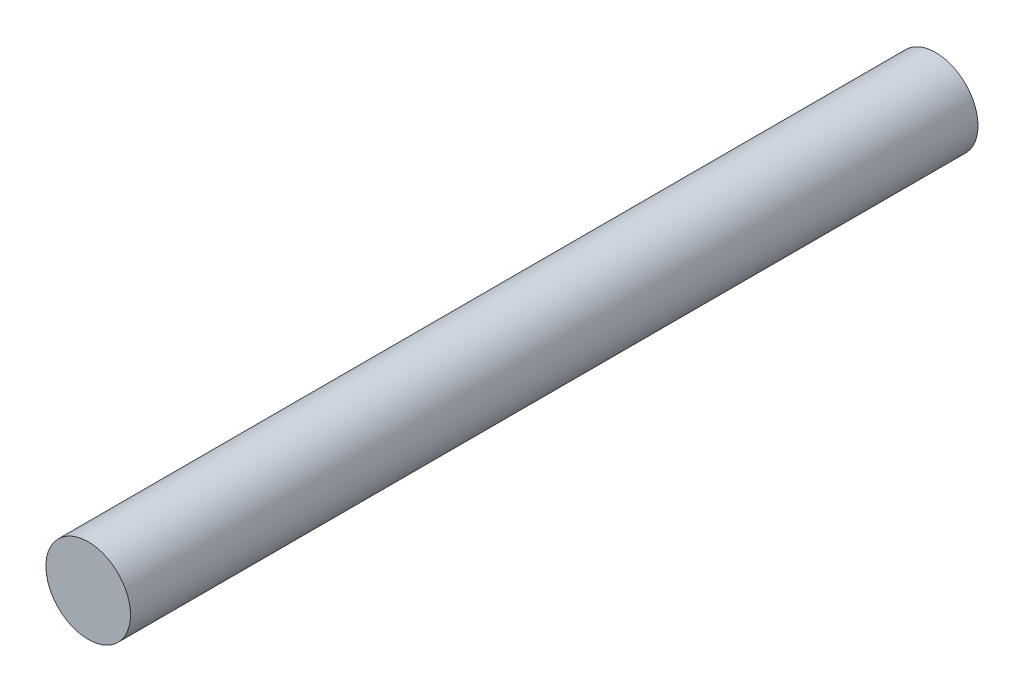
ISO-10303-21;
HEADER;
FILE_DESCRIPTION(('STEP AP214'),'2;1');
FILE_NAME('part.step','',(''),(''),'','','');
FILE_SCHEMA(('AUTOMOTIVE_DESIGN { 1 0 10303 214 1 1 1 1 }'));
ENDSEC;
DATA;
#1=APPLICATION_CONTEXT('core data for automotive mechanical design processes');
#2=APPLICATION_PROTOCOL_DEFINITION('international standard','automotive_design',2000,#1);
#3=PRODUCT_CONTEXT('',#1,'mechanical');
#4=PRODUCT('Part','Part','',(#3));
#5=PRODUCT_RELATED_PRODUCT_CATEGORY('part','',(#4));
#6=PRODUCT_DEFINITION_FORMATION('','',#4);
#7=PRODUCT_DEFINITION_CONTEXT('part definition',#1,'design');
#8=PRODUCT_DEFINITION('design','',#6,#7);
#9=PRODUCT_DEFINITION_SHAPE('','',#8);
#10=(LENGTH_UNIT() NAMED_UNIT(*) SI_UNIT(.MILLI.,.METRE.));
#11=(NAMED_UNIT(*) PLANE_ANGLE_UNIT() SI_UNIT($,.RADIAN.));
#12=(NAMED_UNIT(*) SI_UNIT($,.STERADIAN.) SOLID_ANGLE_UNIT());
#13=UNCERTAINTY_MEASURE_WITH_UNIT(LENGTH_MEASURE(1.E-05),#10,'distance_accuracy_value','');
#14=(GEOMETRIC_REPRESENTATION_CONTEXT(3) GLOBAL_UNCERTAINTY_ASSIGNED_CONTEXT((#13)) GLOBAL_UNIT_ASSIGNED_CONTEXT((#10,
#11,#12)) REPRESENTATION_CONTEXT('',''));
#15=CARTESIAN_POINT('',(0.,0.,0.));
#16=DIRECTION('',(0.,0.,1.));
#17=DIRECTION('',(1.,0.,0.));
#18=AXIS2_PLACEMENT_3D('',#15,#16,#17);
#19=CARTESIAN_POINT('',(0.,0.,64.897));
#20=DIRECTION('',(0.,0.,-1.));
#21=DIRECTION('',(-1.,0.,0.));
#22=AXIS2_PLACEMENT_3D('',#19,#20,#21);
#23=CYLINDRICAL_SURFACE('',#22,3.2385);
#24=CARTESIAN_POINT('',(0.,0.,64.897));
#25=DIRECTION('',(0.,0.,1.));
#26=DIRECTION('',(1.,0.,0.));
#27=AXIS2_PLACEMENT_3D('',#24,#25,#26);
#28=CIRCLE('',#27,3.2385);
#29=CARTESIAN_POINT('',(3.2385,0.,64.897));
#30=VERTEX_POINT('',#29);
#31=EDGE_CURVE('E10',#30,#30,#28,.T.);
#32=ORIENTED_EDGE('',*,*,#31,.F.);
#33=EDGE_LOOP('',(#32));
#34=FACE_BOUND('',#33,.T.);
#35=CARTESIAN_POINT('',(0.,0.,0.));
#36=DIRECTION('',(0.,0.,1.));
#37=DIRECTION('',(1.,0.,0.));
#38=AXIS2_PLACEMENT_3D('',#35,#36,#37);
#39=CIRCLE('',#38,3.2385);
#40=CARTESIAN_POINT('',(3.2385,0.,0.));
#41=VERTEX_POINT('',#40);
#42=EDGE_CURVE('E38',#41,#41,#39,.T.);
#43=ORIENTED_EDGE('',*,*,#42,.T.);
#44=EDGE_LOOP('',(#43));
#45=FACE_BOUND('',#44,.T.);
#46=ADVANCED_FACE('F35',(#34,#45),#23,.T.);
#47=CARTESIAN_POINT('',(0.,0.,64.897));
#48=DIRECTION('',(0.,0.,1.));
#49=DIRECTION('',(1.,0.,0.));
#50=AXIS2_PLACEMENT_3D('',#47,#48,#49);
#51=PLANE('',#50);
#52=ORIENTED_EDGE('',*,*,#31,.T.);
#53=EDGE_LOOP('',(#52));
#54=FACE_BOUND('',#53,.T.);
#55=ADVANCED_FACE('F50',(#54),#51,.T.);
#56=CARTESIAN_POINT('',(0.,0.,0.));
#57=DIRECTION('',(0.,0.,1.));
#58=DIRECTION('',(1.,0.,0.));
#59=AXIS2_PLACEMENT_3D('',#56,#57,#58);
#60=PLANE('',#59);
#61=ORIENTED_EDGE('',*,*,#42,.F.);
#62=EDGE_LOOP('',(#61));
#63=FACE_BOUND('',#62,.T.);
#64=ADVANCED_FACE('F48',(#63),#60,.F.);
#65=CLOSED_SHELL('',(#46,#55,#64));
#66=MANIFOLD_SOLID_BREP('B2',#65);
#67=ADVANCED_BREP_SHAPE_REPRESENTATION('',(#18,#66),#14);
#68=SHAPE_DEFINITION_REPRESENTATION(#9,#67);
ENDSEC;
END-ISO-10303-21;
